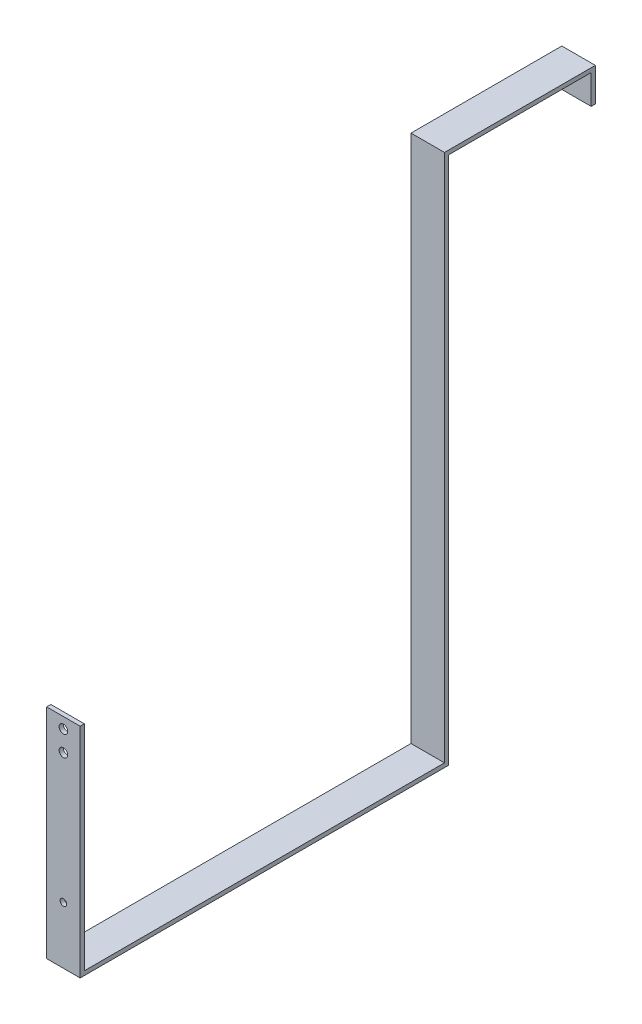
ISO-10303-21;
HEADER;
FILE_DESCRIPTION(('STEP AP214'),'2;1');
FILE_NAME('part.step','',(''),(''),'','','');
FILE_SCHEMA(('AUTOMOTIVE_DESIGN { 1 0 10303 214 1 1 1 1 }'));
ENDSEC;
DATA;
#1=APPLICATION_CONTEXT('core data for automotive mechanical design processes');
#2=APPLICATION_PROTOCOL_DEFINITION('international standard','automotive_design',2000,#1);
#3=PRODUCT_CONTEXT('',#1,'mechanical');
#4=PRODUCT('Part','Part','',(#3));
#5=PRODUCT_RELATED_PRODUCT_CATEGORY('part','',(#4));
#6=PRODUCT_DEFINITION_FORMATION('','',#4);
#7=PRODUCT_DEFINITION_CONTEXT('part definition',#1,'design');
#8=PRODUCT_DEFINITION('design','',#6,#7);
#9=PRODUCT_DEFINITION_SHAPE('','',#8);
#10=(LENGTH_UNIT() NAMED_UNIT(*) SI_UNIT(.MILLI.,.METRE.));
#11=(NAMED_UNIT(*) PLANE_ANGLE_UNIT() SI_UNIT($,.RADIAN.));
#12=(NAMED_UNIT(*) SI_UNIT($,.STERADIAN.) SOLID_ANGLE_UNIT());
#13=UNCERTAINTY_MEASURE_WITH_UNIT(LENGTH_MEASURE(1.E-05),#10,'distance_accuracy_value','');
#14=(GEOMETRIC_REPRESENTATION_CONTEXT(3) GLOBAL_UNCERTAINTY_ASSIGNED_CONTEXT((#13)) GLOBAL_UNIT_ASSIGNED_CONTEXT((#10,
#11,#12)) REPRESENTATION_CONTEXT('',''));
#15=CARTESIAN_POINT('',(0.,0.,0.));
#16=DIRECTION('',(0.,0.,1.));
#17=DIRECTION('',(1.,0.,0.));
#18=AXIS2_PLACEMENT_3D('',#15,#16,#17);
#19=CARTESIAN_POINT('',(25.4,-798.515,781.25));
#20=DIRECTION('',(0.,-1.,0.));
#21=DIRECTION('',(0.,0.,-1.));
#22=AXIS2_PLACEMENT_3D('',#19,#20,#21);
#23=PLANE('',#22);
#24=DIRECTION('',(-1.,0.,0.));
#25=VECTOR('',#24,1.);
#26=CARTESIAN_POINT('',(25.4,-798.515,774.94));
#27=LINE('',#26,#25);
#28=CARTESIAN_POINT('',(25.4,-798.515,774.94));
#29=VERTEX_POINT('',#28);
#30=CARTESIAN_POINT('',(-25.4,-798.515,774.94));
#31=VERTEX_POINT('',#30);
#32=EDGE_CURVE('E181',#29,#31,#27,.T.);
#33=ORIENTED_EDGE('',*,*,#32,.F.);
#34=DIRECTION('',(0.,0.,-1.));
#35=VECTOR('',#34,1.);
#36=CARTESIAN_POINT('',(25.4,-798.515,781.25));
#37=LINE('',#36,#35);
#38=CARTESIAN_POINT('',(25.4,-798.515,228.75));
#39=VERTEX_POINT('',#38);
#40=EDGE_CURVE('E201',#29,#39,#37,.T.);
#41=ORIENTED_EDGE('',*,*,#40,.T.);
#42=DIRECTION('',(-1.,0.,0.));
#43=VECTOR('',#42,1.);
#44=CARTESIAN_POINT('',(25.4,-798.515,228.75));
#45=LINE('',#44,#43);
#46=CARTESIAN_POINT('',(-25.4,-798.515,228.75));
#47=VERTEX_POINT('',#46);
#48=EDGE_CURVE('E188',#39,#47,#45,.T.);
#49=ORIENTED_EDGE('',*,*,#48,.T.);
#50=DIRECTION('',(0.,0.,-1.));
#51=VECTOR('',#50,1.);
#52=CARTESIAN_POINT('',(-25.4,-798.515,781.25));
#53=LINE('',#52,#51);
#54=EDGE_CURVE('E197',#31,#47,#53,.T.);
#55=ORIENTED_EDGE('',*,*,#54,.F.);
#56=EDGE_LOOP('',(#33,#41,#49,#55));
#57=FACE_BOUND('',#56,.T.);
#58=ADVANCED_FACE('F37',(#57),#23,.F.);
#59=CARTESIAN_POINT('',(0.,0.,228.75));
#60=DIRECTION('',(0.,0.,-1.));
#61=DIRECTION('',(-1.,0.,0.));
#62=AXIS2_PLACEMENT_3D('',#59,#60,#61);
#63=PLANE('',#62);
#64=ORIENTED_EDGE('',*,*,#48,.F.);
#65=DIRECTION('',(0.,1.,0.));
#66=VECTOR('',#65,1.);
#67=CARTESIAN_POINT('',(25.4,-3.155,228.75));
#68=LINE('',#67,#66);
#69=CARTESIAN_POINT('',(25.4,3.155,228.75));
#70=VERTEX_POINT('',#69);
#71=EDGE_CURVE('E136',#39,#70,#68,.T.);
#72=ORIENTED_EDGE('',*,*,#71,.T.);
#73=DIRECTION('',(-1.,0.,0.));
#74=VECTOR('',#73,1.);
#75=CARTESIAN_POINT('',(-25.4,3.155,228.75));
#76=LINE('',#75,#74);
#77=CARTESIAN_POINT('',(-25.4,3.155,228.75));
#78=VERTEX_POINT('',#77);
#79=EDGE_CURVE('E220',#70,#78,#76,.T.);
#80=ORIENTED_EDGE('',*,*,#79,.T.);
#81=DIRECTION('',(0.,-1.,0.));
#82=VECTOR('',#81,1.);
#83=CARTESIAN_POINT('',(-25.4,-3.155,228.75));
#84=LINE('',#83,#82);
#85=EDGE_CURVE('E222',#78,#47,#84,.T.);
#86=ORIENTED_EDGE('',*,*,#85,.T.);
#87=EDGE_LOOP('',(#64,#72,#80,#86));
#88=FACE_BOUND('',#87,.T.);
#89=ADVANCED_FACE('F274',(#88),#63,.F.);
#90=CARTESIAN_POINT('',(-25.4,-3.155,228.75));
#91=DIRECTION('',(0.,1.,0.));
#92=DIRECTION('',(0.,0.,1.));
#93=AXIS2_PLACEMENT_3D('',#90,#91,#92);
#94=PLANE('',#93);
#95=DIRECTION('',(0.,0.,-1.));
#96=VECTOR('',#95,1.);
#97=CARTESIAN_POINT('',(-25.4,-3.155,228.75));
#98=LINE('',#97,#96);
#99=CARTESIAN_POINT('',(-25.4,-3.155,222.44));
#100=VERTEX_POINT('',#99);
#101=CARTESIAN_POINT('',(-25.4,-3.155,6.31000000000007));
#102=VERTEX_POINT('',#101);
#103=EDGE_CURVE('E59',#100,#102,#98,.T.);
#104=ORIENTED_EDGE('',*,*,#103,.T.);
#105=DIRECTION('',(1.,0.,0.));
#106=VECTOR('',#105,1.);
#107=CARTESIAN_POINT('',(-25.4,-3.155,6.31000000000001));
#108=LINE('',#107,#106);
#109=CARTESIAN_POINT('',(25.4,-3.155,6.31000000000007));
#110=VERTEX_POINT('',#109);
#111=EDGE_CURVE('E54',#102,#110,#108,.T.);
#112=ORIENTED_EDGE('',*,*,#111,.T.);
#113=DIRECTION('',(0.,0.,-1.));
#114=VECTOR('',#113,1.);
#115=CARTESIAN_POINT('',(25.4,-3.155,228.75));
#116=LINE('',#115,#114);
#117=CARTESIAN_POINT('',(25.4,-3.155,222.44));
#118=VERTEX_POINT('',#117);
#119=EDGE_CURVE('E225',#118,#110,#116,.T.);
#120=ORIENTED_EDGE('',*,*,#119,.F.);
#121=DIRECTION('',(1.,0.,0.));
#122=VECTOR('',#121,1.);
#123=CARTESIAN_POINT('',(25.4,-3.155,222.44));
#124=LINE('',#123,#122);
#125=EDGE_CURVE('E203',#100,#118,#124,.T.);
#126=ORIENTED_EDGE('',*,*,#125,.F.);
#127=EDGE_LOOP('',(#104,#112,#120,#126));
#128=FACE_BOUND('',#127,.T.);
#129=ADVANCED_FACE('F286',(#128),#94,.F.);
#130=CARTESIAN_POINT('',(25.4,-3.155,228.75));
#131=DIRECTION('',(-1.,0.,0.));
#132=DIRECTION('',(0.,0.,1.));
#133=AXIS2_PLACEMENT_3D('',#130,#131,#132);
#134=PLANE('',#133);
#135=ORIENTED_EDGE('',*,*,#119,.T.);
#136=DIRECTION('',(0.,1.,0.));
#137=VECTOR('',#136,1.);
#138=CARTESIAN_POINT('',(25.4,-47.645,6.31));
#139=LINE('',#138,#137);
#140=CARTESIAN_POINT('',(25.4,-47.645,6.31));
#141=VERTEX_POINT('',#140);
#142=EDGE_CURVE('E164',#141,#110,#139,.T.);
#143=ORIENTED_EDGE('',*,*,#142,.F.);
#144=DIRECTION('',(0.,0.,-1.));
#145=VECTOR('',#144,1.);
#146=CARTESIAN_POINT('',(25.4,-47.645,0.));
#147=LINE('',#146,#145);
#148=CARTESIAN_POINT('',(25.4,-47.645,0.));
#149=VERTEX_POINT('',#148);
#150=EDGE_CURVE('E161',#141,#149,#147,.T.);
#151=ORIENTED_EDGE('',*,*,#150,.T.);
#152=DIRECTION('',(0.,1.,0.));
#153=VECTOR('',#152,1.);
#154=CARTESIAN_POINT('',(25.4,-3.155,0.));
#155=LINE('',#154,#153);
#156=CARTESIAN_POINT('',(25.4,3.155,0.));
#157=VERTEX_POINT('',#156);
#158=EDGE_CURVE('E151',#149,#157,#155,.T.);
#159=ORIENTED_EDGE('',*,*,#158,.T.);
#160=DIRECTION('',(0.,0.,-1.));
#161=VECTOR('',#160,1.);
#162=CARTESIAN_POINT('',(25.4,3.155,228.75));
#163=LINE('',#162,#161);
#164=EDGE_CURVE('E11',#70,#157,#163,.T.);
#165=ORIENTED_EDGE('',*,*,#164,.F.);
#166=ORIENTED_EDGE('',*,*,#71,.F.);
#167=ORIENTED_EDGE('',*,*,#40,.F.);
#168=DIRECTION('',(0.,-1.,0.));
#169=VECTOR('',#168,1.);
#170=CARTESIAN_POINT('',(25.4,-484.125,774.94));
#171=LINE('',#170,#169);
#172=CARTESIAN_POINT('',(25.4,-474.125,774.94));
#173=VERTEX_POINT('',#172);
#174=EDGE_CURVE('E186',#173,#29,#171,.T.);
#175=ORIENTED_EDGE('',*,*,#174,.F.);
#176=DIRECTION('',(0.,0.,-1.));
#177=VECTOR('',#176,1.);
#178=CARTESIAN_POINT('',(25.4,-474.125,774.94));
#179=LINE('',#178,#177);
#180=CARTESIAN_POINT('',(25.4,-474.125,781.25));
#181=VERTEX_POINT('',#180);
#182=EDGE_CURVE('E169',#181,#173,#179,.T.);
#183=ORIENTED_EDGE('',*,*,#182,.F.);
#184=DIRECTION('',(0.,1.,0.));
#185=VECTOR('',#184,1.);
#186=CARTESIAN_POINT('',(25.4,-804.825,781.25));
#187=LINE('',#186,#185);
#188=CARTESIAN_POINT('',(25.4,-804.825,781.25));
#189=VERTEX_POINT('',#188);
#190=EDGE_CURVE('E195',#189,#181,#187,.T.);
#191=ORIENTED_EDGE('',*,*,#190,.F.);
#192=DIRECTION('',(0.,0.,1.));
#193=VECTOR('',#192,1.);
#194=CARTESIAN_POINT('',(25.4,-804.825,228.75));
#195=LINE('',#194,#193);
#196=CARTESIAN_POINT('',(25.4,-804.825,222.44));
#197=VERTEX_POINT('',#196);
#198=EDGE_CURVE('E209',#197,#189,#195,.T.);
#199=ORIENTED_EDGE('',*,*,#198,.F.);
#200=DIRECTION('',(0.,1.,0.));
#201=VECTOR('',#200,1.);
#202=CARTESIAN_POINT('',(25.4,-804.825,222.44));
#203=LINE('',#202,#201);
#204=EDGE_CURVE('E211',#197,#118,#203,.T.);
#205=ORIENTED_EDGE('',*,*,#204,.T.);
#206=EDGE_LOOP('',(#135,#143,#151,#159,#165,#166,#167,#175,#183,#191,#199,#205));
#207=FACE_BOUND('',#206,.T.);
#208=ADVANCED_FACE('F39',(#207),#134,.F.);
#209=CARTESIAN_POINT('',(-25.4,3.155,228.75));
#210=DIRECTION('',(0.,-1.,0.));
#211=DIRECTION('',(0.,0.,-1.));
#212=AXIS2_PLACEMENT_3D('',#209,#210,#211);
#213=PLANE('',#212);
#214=ORIENTED_EDGE('',*,*,#164,.T.);
#215=DIRECTION('',(-1.,0.,0.));
#216=VECTOR('',#215,1.);
#217=CARTESIAN_POINT('',(-25.4,3.155,0.));
#218=LINE('',#217,#216);
#219=CARTESIAN_POINT('',(-25.4,3.155,0.));
#220=VERTEX_POINT('',#219);
#221=EDGE_CURVE('E137',#157,#220,#218,.T.);
#222=ORIENTED_EDGE('',*,*,#221,.T.);
#223=DIRECTION('',(0.,0.,-1.));
#224=VECTOR('',#223,1.);
#225=CARTESIAN_POINT('',(-25.4,3.155,228.75));
#226=LINE('',#225,#224);
#227=EDGE_CURVE('E46',#78,#220,#226,.T.);
#228=ORIENTED_EDGE('',*,*,#227,.F.);
#229=ORIENTED_EDGE('',*,*,#79,.F.);
#230=EDGE_LOOP('',(#214,#222,#228,#229));
#231=FACE_BOUND('',#230,.T.);
#232=ADVANCED_FACE('F279',(#231),#213,.F.);
#233=CARTESIAN_POINT('',(-25.4,-3.155,228.75));
#234=DIRECTION('',(1.,0.,0.));
#235=DIRECTION('',(0.,0.,-1.));
#236=AXIS2_PLACEMENT_3D('',#233,#234,#235);
#237=PLANE('',#236);
#238=ORIENTED_EDGE('',*,*,#227,.T.);
#239=DIRECTION('',(0.,-1.,0.));
#240=VECTOR('',#239,1.);
#241=CARTESIAN_POINT('',(-25.4,-3.155,0.));
#242=LINE('',#241,#240);
#243=CARTESIAN_POINT('',(-25.4,-47.645,0.));
#244=VERTEX_POINT('',#243);
#245=EDGE_CURVE('E125',#220,#244,#242,.T.);
#246=ORIENTED_EDGE('',*,*,#245,.T.);
#247=DIRECTION('',(0.,0.,1.));
#248=VECTOR('',#247,1.);
#249=CARTESIAN_POINT('',(-25.4,-47.645,6.31000000000001));
#250=LINE('',#249,#248);
#251=CARTESIAN_POINT('',(-25.4,-47.645,6.31000000000001));
#252=VERTEX_POINT('',#251);
#253=EDGE_CURVE('E129',#244,#252,#250,.T.);
#254=ORIENTED_EDGE('',*,*,#253,.T.);
#255=DIRECTION('',(0.,1.,0.));
#256=VECTOR('',#255,1.);
#257=CARTESIAN_POINT('',(-25.4,-47.645,6.31000000000001));
#258=LINE('',#257,#256);
#259=EDGE_CURVE('E163',#252,#102,#258,.T.);
#260=ORIENTED_EDGE('',*,*,#259,.T.);
#261=ORIENTED_EDGE('',*,*,#103,.F.);
#262=DIRECTION('',(0.,1.,0.));
#263=VECTOR('',#262,1.);
#264=CARTESIAN_POINT('',(-25.4,-804.825,222.44));
#265=LINE('',#264,#263);
#266=CARTESIAN_POINT('',(-25.4,-804.825,222.44));
#267=VERTEX_POINT('',#266);
#268=EDGE_CURVE('E216',#267,#100,#265,.T.);
#269=ORIENTED_EDGE('',*,*,#268,.F.);
#270=DIRECTION('',(0.,0.,-1.));
#271=VECTOR('',#270,1.);
#272=CARTESIAN_POINT('',(-25.4,-804.825,222.44));
#273=LINE('',#272,#271);
#274=CARTESIAN_POINT('',(-25.4,-804.825,781.25));
#275=VERTEX_POINT('',#274);
#276=EDGE_CURVE('E204',#275,#267,#273,.T.);
#277=ORIENTED_EDGE('',*,*,#276,.F.);
#278=DIRECTION('',(0.,-1.,0.));
#279=VECTOR('',#278,1.);
#280=CARTESIAN_POINT('',(-25.4,-798.515,781.25));
#281=LINE('',#280,#279);
#282=CARTESIAN_POINT('',(-25.4,-474.125,781.25));
#283=VERTEX_POINT('',#282);
#284=EDGE_CURVE('E189',#283,#275,#281,.T.);
#285=ORIENTED_EDGE('',*,*,#284,.F.);
#286=DIRECTION('',(0.,0.,1.));
#287=VECTOR('',#286,1.);
#288=CARTESIAN_POINT('',(-25.4,-474.125,781.25));
#289=LINE('',#288,#287);
#290=CARTESIAN_POINT('',(-25.4,-474.125,774.94));
#291=VERTEX_POINT('',#290);
#292=EDGE_CURVE('E175',#291,#283,#289,.T.);
#293=ORIENTED_EDGE('',*,*,#292,.F.);
#294=DIRECTION('',(0.,-1.,0.));
#295=VECTOR('',#294,1.);
#296=CARTESIAN_POINT('',(-25.4,-484.125,774.94));
#297=LINE('',#296,#295);
#298=EDGE_CURVE('E183',#291,#31,#297,.T.);
#299=ORIENTED_EDGE('',*,*,#298,.T.);
#300=ORIENTED_EDGE('',*,*,#54,.T.);
#301=ORIENTED_EDGE('',*,*,#85,.F.);
#302=EDGE_LOOP('',(#238,#246,#254,#260,#261,#269,#277,#285,#293,#299,#300,#301));
#303=FACE_BOUND('',#302,.T.);
#304=ADVANCED_FACE('F127',(#303),#237,.F.);
#305=CARTESIAN_POINT('',(0.,0.,0.));
#306=DIRECTION('',(0.,0.,-1.));
#307=DIRECTION('',(-1.,0.,0.));
#308=AXIS2_PLACEMENT_3D('',#305,#306,#307);
#309=PLANE('',#308);
#310=ORIENTED_EDGE('',*,*,#158,.F.);
#311=DIRECTION('',(-1.,0.,0.));
#312=VECTOR('',#311,1.);
#313=CARTESIAN_POINT('',(-25.4,-47.645,0.));
#314=LINE('',#313,#312);
#315=EDGE_CURVE('E144',#149,#244,#314,.T.);
#316=ORIENTED_EDGE('',*,*,#315,.T.);
#317=ORIENTED_EDGE('',*,*,#245,.F.);
#318=ORIENTED_EDGE('',*,*,#221,.F.);
#319=EDGE_LOOP('',(#310,#316,#317,#318));
#320=FACE_BOUND('',#319,.T.);
#321=ADVANCED_FACE('F149',(#320),#309,.T.);
#322=CARTESIAN_POINT('',(25.4,-804.825,222.44));
#323=DIRECTION('',(0.,0.,1.));
#324=DIRECTION('',(1.,0.,0.));
#325=AXIS2_PLACEMENT_3D('',#322,#323,#324);
#326=PLANE('',#325);
#327=ORIENTED_EDGE('',*,*,#125,.T.);
#328=ORIENTED_EDGE('',*,*,#204,.F.);
#329=DIRECTION('',(1.,0.,0.));
#330=VECTOR('',#329,1.);
#331=CARTESIAN_POINT('',(25.4,-804.825,222.44));
#332=LINE('',#331,#330);
#333=EDGE_CURVE('E207',#267,#197,#332,.T.);
#334=ORIENTED_EDGE('',*,*,#333,.F.);
#335=ORIENTED_EDGE('',*,*,#268,.T.);
#336=EDGE_LOOP('',(#327,#328,#334,#335));
#337=FACE_BOUND('',#336,.T.);
#338=ADVANCED_FACE('F297',(#337),#326,.F.);
#339=CARTESIAN_POINT('',(0.,-804.825,0.));
#340=DIRECTION('',(0.,1.,0.));
#341=DIRECTION('',(0.,0.,1.));
#342=AXIS2_PLACEMENT_3D('',#339,#340,#341);
#343=PLANE('',#342);
#344=ORIENTED_EDGE('',*,*,#276,.T.);
#345=ORIENTED_EDGE('',*,*,#333,.T.);
#346=ORIENTED_EDGE('',*,*,#198,.T.);
#347=DIRECTION('',(1.,0.,0.));
#348=VECTOR('',#347,1.);
#349=CARTESIAN_POINT('',(-25.4,-804.825,781.25));
#350=LINE('',#349,#348);
#351=EDGE_CURVE('E192',#275,#189,#350,.T.);
#352=ORIENTED_EDGE('',*,*,#351,.F.);
#353=EDGE_LOOP('',(#344,#345,#346,#352));
#354=FACE_BOUND('',#353,.T.);
#355=ADVANCED_FACE('F252',(#354),#343,.F.);
#356=CARTESIAN_POINT('',(0.,0.,781.25));
#357=DIRECTION('',(0.,0.,1.));
#358=DIRECTION('',(1.,0.,0.));
#359=AXIS2_PLACEMENT_3D('',#356,#357,#358);
#360=PLANE('',#359);
#361=CARTESIAN_POINT('',(0.,-718.315,781.25));
#362=DIRECTION('',(0.,0.,1.));
#363=DIRECTION('',(1.,0.,0.));
#364=AXIS2_PLACEMENT_3D('',#361,#362,#363);
#365=CIRCLE('',#364,5.00000000000001);
#366=CARTESIAN_POINT('',(5.00000000000001,-718.315,781.25));
#367=VERTEX_POINT('',#366);
#368=EDGE_CURVE('E240',#367,#367,#365,.T.);
#369=ORIENTED_EDGE('',*,*,#368,.F.);
#370=EDGE_LOOP('',(#369));
#371=FACE_BOUND('',#370,.T.);
#372=CARTESIAN_POINT('',(0.,-490.625,781.25));
#373=DIRECTION('',(0.,0.,1.));
#374=DIRECTION('',(1.,0.,0.));
#375=AXIS2_PLACEMENT_3D('',#372,#373,#374);
#376=CIRCLE('',#375,6.5);
#377=CARTESIAN_POINT('',(6.50000000000001,-490.625,781.25));
#378=VERTEX_POINT('',#377);
#379=EDGE_CURVE('E232',#378,#378,#376,.T.);
#380=ORIENTED_EDGE('',*,*,#379,.F.);
#381=EDGE_LOOP('',(#380));
#382=FACE_BOUND('',#381,.T.);
#383=CARTESIAN_POINT('',(0.,-521.625,781.25));
#384=DIRECTION('',(0.,0.,1.));
#385=DIRECTION('',(1.,0.,0.));
#386=AXIS2_PLACEMENT_3D('',#383,#384,#385);
#387=CIRCLE('',#386,6.5);
#388=CARTESIAN_POINT('',(6.50000000000001,-521.625,781.25));
#389=VERTEX_POINT('',#388);
#390=EDGE_CURVE('E155',#389,#389,#387,.T.);
#391=ORIENTED_EDGE('',*,*,#390,.F.);
#392=EDGE_LOOP('',(#391));
#393=FACE_BOUND('',#392,.T.);
#394=ORIENTED_EDGE('',*,*,#284,.T.);
#395=ORIENTED_EDGE('',*,*,#351,.T.);
#396=ORIENTED_EDGE('',*,*,#190,.T.);
#397=DIRECTION('',(1.,0.,0.));
#398=VECTOR('',#397,1.);
#399=CARTESIAN_POINT('',(25.4,-474.125,781.25));
#400=LINE('',#399,#398);
#401=EDGE_CURVE('E178',#283,#181,#400,.T.);
#402=ORIENTED_EDGE('',*,*,#401,.F.);
#403=EDGE_LOOP('',(#394,#395,#396,#402));
#404=FACE_BOUND('',#403,.T.);
#405=ADVANCED_FACE('F248',(#371,#382,#393,#404),#360,.T.);
#406=CARTESIAN_POINT('',(25.4,-484.125,774.94));
#407=DIRECTION('',(0.,0.,1.));
#408=DIRECTION('',(1.,0.,0.));
#409=AXIS2_PLACEMENT_3D('',#406,#407,#408);
#410=PLANE('',#409);
#411=CARTESIAN_POINT('',(0.,-718.315,774.94));
#412=DIRECTION('',(0.,0.,1.));
#413=DIRECTION('',(1.,0.,0.));
#414=AXIS2_PLACEMENT_3D('',#411,#412,#413);
#415=CIRCLE('',#414,5.00000000000001);
#416=CARTESIAN_POINT('',(5.00000000000001,-718.315,774.94));
#417=VERTEX_POINT('',#416);
#418=EDGE_CURVE('E41',#417,#417,#415,.T.);
#419=ORIENTED_EDGE('',*,*,#418,.T.);
#420=EDGE_LOOP('',(#419));
#421=FACE_BOUND('',#420,.T.);
#422=CARTESIAN_POINT('',(0.,-490.625,774.94));
#423=DIRECTION('',(0.,0.,1.));
#424=DIRECTION('',(1.,0.,0.));
#425=AXIS2_PLACEMENT_3D('',#422,#423,#424);
#426=CIRCLE('',#425,6.5);
#427=CARTESIAN_POINT('',(6.50000000000001,-490.625,774.94));
#428=VERTEX_POINT('',#427);
#429=EDGE_CURVE('E230',#428,#428,#426,.T.);
#430=ORIENTED_EDGE('',*,*,#429,.T.);
#431=EDGE_LOOP('',(#430));
#432=FACE_BOUND('',#431,.T.);
#433=CARTESIAN_POINT('',(0.,-521.625,774.94));
#434=DIRECTION('',(0.,0.,1.));
#435=DIRECTION('',(1.,0.,0.));
#436=AXIS2_PLACEMENT_3D('',#433,#434,#435);
#437=CIRCLE('',#436,6.5);
#438=CARTESIAN_POINT('',(6.50000000000001,-521.625,774.94));
#439=VERTEX_POINT('',#438);
#440=EDGE_CURVE('E152',#439,#439,#437,.T.);
#441=ORIENTED_EDGE('',*,*,#440,.T.);
#442=EDGE_LOOP('',(#441));
#443=FACE_BOUND('',#442,.T.);
#444=ORIENTED_EDGE('',*,*,#32,.T.);
#445=ORIENTED_EDGE('',*,*,#298,.F.);
#446=DIRECTION('',(-1.,0.,0.));
#447=VECTOR('',#446,1.);
#448=CARTESIAN_POINT('',(-25.4,-474.125,774.94));
#449=LINE('',#448,#447);
#450=EDGE_CURVE('E172',#173,#291,#449,.T.);
#451=ORIENTED_EDGE('',*,*,#450,.F.);
#452=ORIENTED_EDGE('',*,*,#174,.T.);
#453=EDGE_LOOP('',(#444,#445,#451,#452));
#454=FACE_BOUND('',#453,.T.);
#455=ADVANCED_FACE('F251',(#421,#432,#443,#454),#410,.F.);
#456=CARTESIAN_POINT('',(0.,-474.125,0.));
#457=DIRECTION('',(0.,-1.,0.));
#458=DIRECTION('',(0.,0.,-1.));
#459=AXIS2_PLACEMENT_3D('',#456,#457,#458);
#460=PLANE('',#459);
#461=ORIENTED_EDGE('',*,*,#182,.T.);
#462=ORIENTED_EDGE('',*,*,#450,.T.);
#463=ORIENTED_EDGE('',*,*,#292,.T.);
#464=ORIENTED_EDGE('',*,*,#401,.T.);
#465=EDGE_LOOP('',(#461,#462,#463,#464));
#466=FACE_BOUND('',#465,.T.);
#467=ADVANCED_FACE('F263',(#466),#460,.F.);
#468=CARTESIAN_POINT('',(25.4,-47.645,6.31));
#469=DIRECTION('',(0.,0.,1.));
#470=DIRECTION('',(1.,0.,0.));
#471=AXIS2_PLACEMENT_3D('',#468,#469,#470);
#472=PLANE('',#471);
#473=ORIENTED_EDGE('',*,*,#111,.F.);
#474=ORIENTED_EDGE('',*,*,#259,.F.);
#475=DIRECTION('',(1.,0.,0.));
#476=VECTOR('',#475,1.);
#477=CARTESIAN_POINT('',(25.4,-47.645,6.31));
#478=LINE('',#477,#476);
#479=EDGE_CURVE('E147',#252,#141,#478,.T.);
#480=ORIENTED_EDGE('',*,*,#479,.T.);
#481=ORIENTED_EDGE('',*,*,#142,.T.);
#482=EDGE_LOOP('',(#473,#474,#480,#481));
#483=FACE_BOUND('',#482,.T.);
#484=ADVANCED_FACE('F342',(#483),#472,.T.);
#485=CARTESIAN_POINT('',(0.,-47.645,0.));
#486=DIRECTION('',(0.,-1.,0.));
#487=DIRECTION('',(0.,0.,-1.));
#488=AXIS2_PLACEMENT_3D('',#485,#486,#487);
#489=PLANE('',#488);
#490=ORIENTED_EDGE('',*,*,#315,.F.);
#491=ORIENTED_EDGE('',*,*,#150,.F.);
#492=ORIENTED_EDGE('',*,*,#479,.F.);
#493=ORIENTED_EDGE('',*,*,#253,.F.);
#494=EDGE_LOOP('',(#490,#491,#492,#493));
#495=FACE_BOUND('',#494,.T.);
#496=ADVANCED_FACE('F142',(#495),#489,.T.);
#497=CARTESIAN_POINT('',(0.,-521.625,771.25));
#498=DIRECTION('',(0.,0.,1.));
#499=DIRECTION('',(1.,0.,0.));
#500=AXIS2_PLACEMENT_3D('',#497,#498,#499);
#501=CYLINDRICAL_SURFACE('',#500,6.5);
#502=ORIENTED_EDGE('',*,*,#390,.T.);
#503=EDGE_LOOP('',(#502));
#504=FACE_BOUND('',#503,.T.);
#505=ORIENTED_EDGE('',*,*,#440,.F.);
#506=EDGE_LOOP('',(#505));
#507=FACE_BOUND('',#506,.T.);
#508=ADVANCED_FACE('F357',(#504,#507),#501,.F.);
#509=CARTESIAN_POINT('',(0.,-490.625,771.25));
#510=DIRECTION('',(0.,0.,1.));
#511=DIRECTION('',(1.,0.,0.));
#512=AXIS2_PLACEMENT_3D('',#509,#510,#511);
#513=CYLINDRICAL_SURFACE('',#512,6.5);
#514=ORIENTED_EDGE('',*,*,#379,.T.);
#515=EDGE_LOOP('',(#514));
#516=FACE_BOUND('',#515,.T.);
#517=ORIENTED_EDGE('',*,*,#429,.F.);
#518=EDGE_LOOP('',(#517));
#519=FACE_BOUND('',#518,.T.);
#520=ADVANCED_FACE('F366',(#516,#519),#513,.F.);
#521=CARTESIAN_POINT('',(0.,-718.315,746.25));
#522=DIRECTION('',(0.,0.,1.));
#523=DIRECTION('',(1.,0.,0.));
#524=AXIS2_PLACEMENT_3D('',#521,#522,#523);
#525=CYLINDRICAL_SURFACE('',#524,5.00000000000001);
#526=ORIENTED_EDGE('',*,*,#368,.T.);
#527=EDGE_LOOP('',(#526));
#528=FACE_BOUND('',#527,.T.);
#529=ORIENTED_EDGE('',*,*,#418,.F.);
#530=EDGE_LOOP('',(#529));
#531=FACE_BOUND('',#530,.T.);
#532=ADVANCED_FACE('F245',(#528,#531),#525,.F.);
#533=CLOSED_SHELL('',(#58,#89,#129,#208,#232,#304,#321,#338,#355,#405,#455,#467,#484,#496,#508,
#520,#532));
#534=MANIFOLD_SOLID_BREP('B2',#533);
#535=ADVANCED_BREP_SHAPE_REPRESENTATION('',(#18,#534),#14);
#536=SHAPE_DEFINITION_REPRESENTATION(#9,#535);
ENDSEC;
END-ISO-10303-21;
